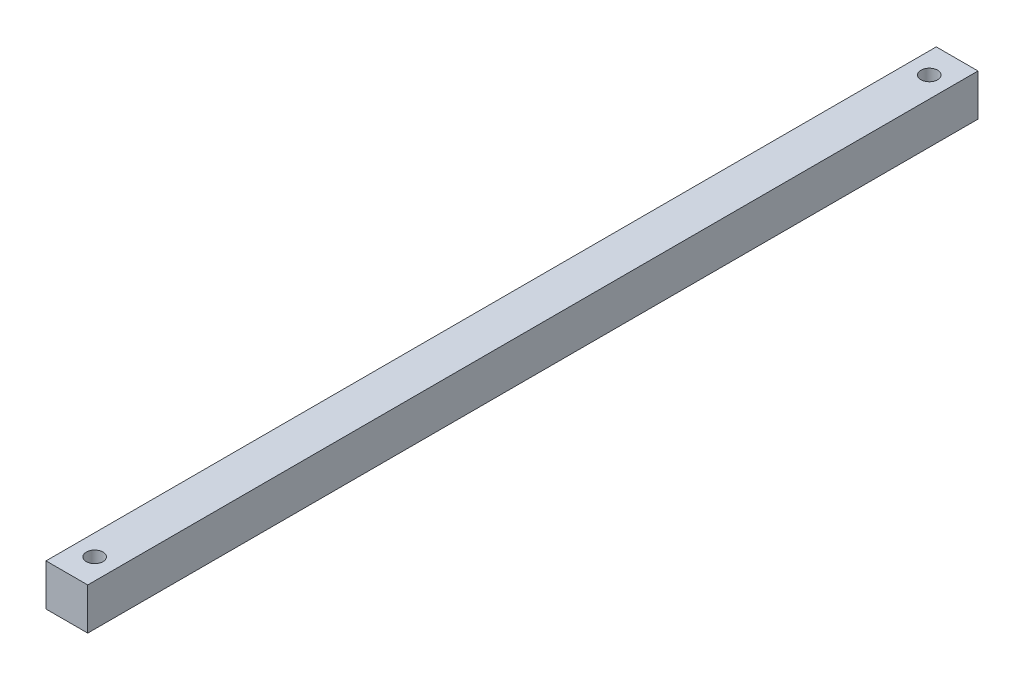
ISO-10303-21;
HEADER;
FILE_DESCRIPTION(('STEP AP214'),'2;1');
FILE_NAME('part.step','',(''),(''),'','','');
FILE_SCHEMA(('AUTOMOTIVE_DESIGN { 1 0 10303 214 1 1 1 1 }'));
ENDSEC;
DATA;
#1=APPLICATION_CONTEXT('core data for automotive mechanical design processes');
#2=APPLICATION_PROTOCOL_DEFINITION('international standard','automotive_design',2000,#1);
#3=PRODUCT_CONTEXT('',#1,'mechanical');
#4=PRODUCT('Part','Part','',(#3));
#5=PRODUCT_RELATED_PRODUCT_CATEGORY('part','',(#4));
#6=PRODUCT_DEFINITION_FORMATION('','',#4);
#7=PRODUCT_DEFINITION_CONTEXT('part definition',#1,'design');
#8=PRODUCT_DEFINITION('design','',#6,#7);
#9=PRODUCT_DEFINITION_SHAPE('','',#8);
#10=(LENGTH_UNIT() NAMED_UNIT(*) SI_UNIT(.MILLI.,.METRE.));
#11=(NAMED_UNIT(*) PLANE_ANGLE_UNIT() SI_UNIT($,.RADIAN.));
#12=(NAMED_UNIT(*) SI_UNIT($,.STERADIAN.) SOLID_ANGLE_UNIT());
#13=UNCERTAINTY_MEASURE_WITH_UNIT(LENGTH_MEASURE(1.E-05),#10,'distance_accuracy_value','');
#14=(GEOMETRIC_REPRESENTATION_CONTEXT(3) GLOBAL_UNCERTAINTY_ASSIGNED_CONTEXT((#13)) GLOBAL_UNIT_ASSIGNED_CONTEXT((#10,
#11,#12)) REPRESENTATION_CONTEXT('',''));
#15=CARTESIAN_POINT('',(0.,0.,0.));
#16=DIRECTION('',(0.,0.,1.));
#17=DIRECTION('',(1.,0.,0.));
#18=AXIS2_PLACEMENT_3D('',#15,#16,#17);
#19=CARTESIAN_POINT('',(0.,0.,320.));
#20=DIRECTION('',(1.,0.,0.));
#21=DIRECTION('',(0.,1.,0.));
#22=AXIS2_PLACEMENT_3D('',#19,#20,#21);
#23=PLANE('',#22);
#24=DIRECTION('',(0.,-1.,0.));
#25=VECTOR('',#24,1.);
#26=CARTESIAN_POINT('',(0.,0.,0.));
#27=LINE('',#26,#25);
#28=CARTESIAN_POINT('',(0.,0.,0.));
#29=VERTEX_POINT('',#28);
#30=CARTESIAN_POINT('',(0.,-15.,0.));
#31=VERTEX_POINT('',#30);
#32=EDGE_CURVE('E104',#29,#31,#27,.T.);
#33=ORIENTED_EDGE('',*,*,#32,.T.);
#34=DIRECTION('',(0.,0.,-1.));
#35=VECTOR('',#34,1.);
#36=CARTESIAN_POINT('',(0.,-15.,320.));
#37=LINE('',#36,#35);
#38=CARTESIAN_POINT('',(0.,-15.,320.));
#39=VERTEX_POINT('',#38);
#40=EDGE_CURVE('E11',#39,#31,#37,.T.);
#41=ORIENTED_EDGE('',*,*,#40,.F.);
#42=DIRECTION('',(0.,-1.,0.));
#43=VECTOR('',#42,1.);
#44=CARTESIAN_POINT('',(0.,0.,320.));
#45=LINE('',#44,#43);
#46=CARTESIAN_POINT('',(0.,0.,320.));
#47=VERTEX_POINT('',#46);
#48=EDGE_CURVE('E92',#47,#39,#45,.T.);
#49=ORIENTED_EDGE('',*,*,#48,.F.);
#50=DIRECTION('',(0.,0.,-1.));
#51=VECTOR('',#50,1.);
#52=CARTESIAN_POINT('',(0.,0.,320.));
#53=LINE('',#52,#51);
#54=EDGE_CURVE('E100',#47,#29,#53,.T.);
#55=ORIENTED_EDGE('',*,*,#54,.T.);
#56=EDGE_LOOP('',(#33,#41,#49,#55));
#57=FACE_BOUND('',#56,.T.);
#58=ADVANCED_FACE('F41',(#57),#23,.F.);
#59=CARTESIAN_POINT('',(0.,-15.,320.));
#60=DIRECTION('',(0.,1.,0.));
#61=DIRECTION('',(0.,0.,1.));
#62=AXIS2_PLACEMENT_3D('',#59,#60,#61);
#63=PLANE('',#62);
#64=CARTESIAN_POINT('',(7.50000000000004,-15.,310.));
#65=DIRECTION('',(0.,1.,0.));
#66=DIRECTION('',(0.,0.,1.));
#67=AXIS2_PLACEMENT_3D('',#64,#65,#66);
#68=CIRCLE('',#67,3.);
#69=CARTESIAN_POINT('',(7.50000000000004,-15.,313.));
#70=VERTEX_POINT('',#69);
#71=EDGE_CURVE('E107',#70,#70,#68,.T.);
#72=ORIENTED_EDGE('',*,*,#71,.T.);
#73=EDGE_LOOP('',(#72));
#74=FACE_BOUND('',#73,.T.);
#75=CARTESIAN_POINT('',(7.5,-15.,10.));
#76=DIRECTION('',(0.,1.,0.));
#77=DIRECTION('',(0.,0.,1.));
#78=AXIS2_PLACEMENT_3D('',#75,#76,#77);
#79=CIRCLE('',#78,3.);
#80=CARTESIAN_POINT('',(7.5,-15.,13.));
#81=VERTEX_POINT('',#80);
#82=EDGE_CURVE('E118',#81,#81,#79,.T.);
#83=ORIENTED_EDGE('',*,*,#82,.T.);
#84=EDGE_LOOP('',(#83));
#85=FACE_BOUND('',#84,.T.);
#86=DIRECTION('',(1.,0.,0.));
#87=VECTOR('',#86,1.);
#88=CARTESIAN_POINT('',(0.,-15.,0.));
#89=LINE('',#88,#87);
#90=CARTESIAN_POINT('',(15.,-15.,0.));
#91=VERTEX_POINT('',#90);
#92=EDGE_CURVE('E96',#31,#91,#89,.T.);
#93=ORIENTED_EDGE('',*,*,#92,.T.);
#94=DIRECTION('',(0.,0.,-1.));
#95=VECTOR('',#94,1.);
#96=CARTESIAN_POINT('',(15.,-15.,320.));
#97=LINE('',#96,#95);
#98=CARTESIAN_POINT('',(15.,-15.,320.));
#99=VERTEX_POINT('',#98);
#100=EDGE_CURVE('E49',#99,#91,#97,.T.);
#101=ORIENTED_EDGE('',*,*,#100,.F.);
#102=DIRECTION('',(1.,0.,0.));
#103=VECTOR('',#102,1.);
#104=CARTESIAN_POINT('',(0.,-15.,320.));
#105=LINE('',#104,#103);
#106=EDGE_CURVE('E87',#39,#99,#105,.T.);
#107=ORIENTED_EDGE('',*,*,#106,.F.);
#108=ORIENTED_EDGE('',*,*,#40,.T.);
#109=EDGE_LOOP('',(#93,#101,#107,#108));
#110=FACE_BOUND('',#109,.T.);
#111=ADVANCED_FACE('F95',(#74,#85,#110),#63,.F.);
#112=CARTESIAN_POINT('',(15.,0.,320.));
#113=DIRECTION('',(-1.,0.,0.));
#114=DIRECTION('',(0.,-1.,0.));
#115=AXIS2_PLACEMENT_3D('',#112,#113,#114);
#116=PLANE('',#115);
#117=DIRECTION('',(0.,1.,0.));
#118=VECTOR('',#117,1.);
#119=CARTESIAN_POINT('',(15.,0.,0.));
#120=LINE('',#119,#118);
#121=CARTESIAN_POINT('',(15.,0.,0.));
#122=VERTEX_POINT('',#121);
#123=EDGE_CURVE('E74',#91,#122,#120,.T.);
#124=ORIENTED_EDGE('',*,*,#123,.T.);
#125=DIRECTION('',(0.,0.,-1.));
#126=VECTOR('',#125,1.);
#127=CARTESIAN_POINT('',(15.,0.,320.));
#128=LINE('',#127,#126);
#129=CARTESIAN_POINT('',(15.,0.,320.));
#130=VERTEX_POINT('',#129);
#131=EDGE_CURVE('E97',#130,#122,#128,.T.);
#132=ORIENTED_EDGE('',*,*,#131,.F.);
#133=DIRECTION('',(0.,1.,0.));
#134=VECTOR('',#133,1.);
#135=CARTESIAN_POINT('',(15.,0.,320.));
#136=LINE('',#135,#134);
#137=EDGE_CURVE('E90',#99,#130,#136,.T.);
#138=ORIENTED_EDGE('',*,*,#137,.F.);
#139=ORIENTED_EDGE('',*,*,#100,.T.);
#140=EDGE_LOOP('',(#124,#132,#138,#139));
#141=FACE_BOUND('',#140,.T.);
#142=ADVANCED_FACE('F98',(#141),#116,.F.);
#143=CARTESIAN_POINT('',(0.,0.,320.));
#144=DIRECTION('',(0.,-1.,0.));
#145=DIRECTION('',(0.,0.,-1.));
#146=AXIS2_PLACEMENT_3D('',#143,#144,#145);
#147=PLANE('',#146);
#148=CARTESIAN_POINT('',(7.50000000000004,0.,310.));
#149=DIRECTION('',(0.,1.,0.));
#150=DIRECTION('',(0.,0.,1.));
#151=AXIS2_PLACEMENT_3D('',#148,#149,#150);
#152=CIRCLE('',#151,3.);
#153=CARTESIAN_POINT('',(7.50000000000004,0.,313.));
#154=VERTEX_POINT('',#153);
#155=EDGE_CURVE('E124',#154,#154,#152,.T.);
#156=ORIENTED_EDGE('',*,*,#155,.F.);
#157=EDGE_LOOP('',(#156));
#158=FACE_BOUND('',#157,.T.);
#159=CARTESIAN_POINT('',(7.5,0.,10.));
#160=DIRECTION('',(0.,1.,0.));
#161=DIRECTION('',(0.,0.,1.));
#162=AXIS2_PLACEMENT_3D('',#159,#160,#161);
#163=CIRCLE('',#162,3.);
#164=CARTESIAN_POINT('',(7.5,0.,13.));
#165=VERTEX_POINT('',#164);
#166=EDGE_CURVE('E121',#165,#165,#163,.T.);
#167=ORIENTED_EDGE('',*,*,#166,.F.);
#168=EDGE_LOOP('',(#167));
#169=FACE_BOUND('',#168,.T.);
#170=DIRECTION('',(-1.,0.,0.));
#171=VECTOR('',#170,1.);
#172=CARTESIAN_POINT('',(0.,0.,0.));
#173=LINE('',#172,#171);
#174=EDGE_CURVE('E80',#122,#29,#173,.T.);
#175=ORIENTED_EDGE('',*,*,#174,.T.);
#176=ORIENTED_EDGE('',*,*,#54,.F.);
#177=DIRECTION('',(-1.,0.,0.));
#178=VECTOR('',#177,1.);
#179=CARTESIAN_POINT('',(0.,0.,320.));
#180=LINE('',#179,#178);
#181=EDGE_CURVE('E57',#130,#47,#180,.T.);
#182=ORIENTED_EDGE('',*,*,#181,.F.);
#183=ORIENTED_EDGE('',*,*,#131,.T.);
#184=EDGE_LOOP('',(#175,#176,#182,#183));
#185=FACE_BOUND('',#184,.T.);
#186=ADVANCED_FACE('F112',(#158,#169,#185),#147,.F.);
#187=CARTESIAN_POINT('',(0.,0.,320.));
#188=DIRECTION('',(0.,0.,1.));
#189=DIRECTION('',(1.,0.,0.));
#190=AXIS2_PLACEMENT_3D('',#187,#188,#189);
#191=PLANE('',#190);
#192=ORIENTED_EDGE('',*,*,#48,.T.);
#193=ORIENTED_EDGE('',*,*,#106,.T.);
#194=ORIENTED_EDGE('',*,*,#137,.T.);
#195=ORIENTED_EDGE('',*,*,#181,.T.);
#196=EDGE_LOOP('',(#192,#193,#194,#195));
#197=FACE_BOUND('',#196,.T.);
#198=ADVANCED_FACE('F88',(#197),#191,.T.);
#199=CARTESIAN_POINT('',(0.,0.,0.));
#200=DIRECTION('',(0.,0.,1.));
#201=DIRECTION('',(1.,0.,0.));
#202=AXIS2_PLACEMENT_3D('',#199,#200,#201);
#203=PLANE('',#202);
#204=ORIENTED_EDGE('',*,*,#32,.F.);
#205=ORIENTED_EDGE('',*,*,#174,.F.);
#206=ORIENTED_EDGE('',*,*,#123,.F.);
#207=ORIENTED_EDGE('',*,*,#92,.F.);
#208=EDGE_LOOP('',(#204,#205,#206,#207));
#209=FACE_BOUND('',#208,.T.);
#210=ADVANCED_FACE('F115',(#209),#203,.F.);
#211=CARTESIAN_POINT('',(7.5,-15.,10.));
#212=DIRECTION('',(0.,1.,0.));
#213=DIRECTION('',(0.,0.,1.));
#214=AXIS2_PLACEMENT_3D('',#211,#212,#213);
#215=CYLINDRICAL_SURFACE('',#214,3.);
#216=ORIENTED_EDGE('',*,*,#82,.F.);
#217=EDGE_LOOP('',(#216));
#218=FACE_BOUND('',#217,.T.);
#219=ORIENTED_EDGE('',*,*,#166,.T.);
#220=EDGE_LOOP('',(#219));
#221=FACE_BOUND('',#220,.T.);
#222=ADVANCED_FACE('F135',(#218,#221),#215,.F.);
#223=CARTESIAN_POINT('',(7.50000000000004,-15.,310.));
#224=DIRECTION('',(0.,1.,0.));
#225=DIRECTION('',(0.,0.,1.));
#226=AXIS2_PLACEMENT_3D('',#223,#224,#225);
#227=CYLINDRICAL_SURFACE('',#226,3.);
#228=ORIENTED_EDGE('',*,*,#71,.F.);
#229=EDGE_LOOP('',(#228));
#230=FACE_BOUND('',#229,.T.);
#231=ORIENTED_EDGE('',*,*,#155,.T.);
#232=EDGE_LOOP('',(#231));
#233=FACE_BOUND('',#232,.T.);
#234=ADVANCED_FACE('F132',(#230,#233),#227,.F.);
#235=CLOSED_SHELL('',(#58,#111,#142,#186,#198,#210,#222,#234));
#236=MANIFOLD_SOLID_BREP('B2',#235);
#237=ADVANCED_BREP_SHAPE_REPRESENTATION('',(#18,#236),#14);
#238=SHAPE_DEFINITION_REPRESENTATION(#9,#237);
ENDSEC;
END-ISO-10303-21;
